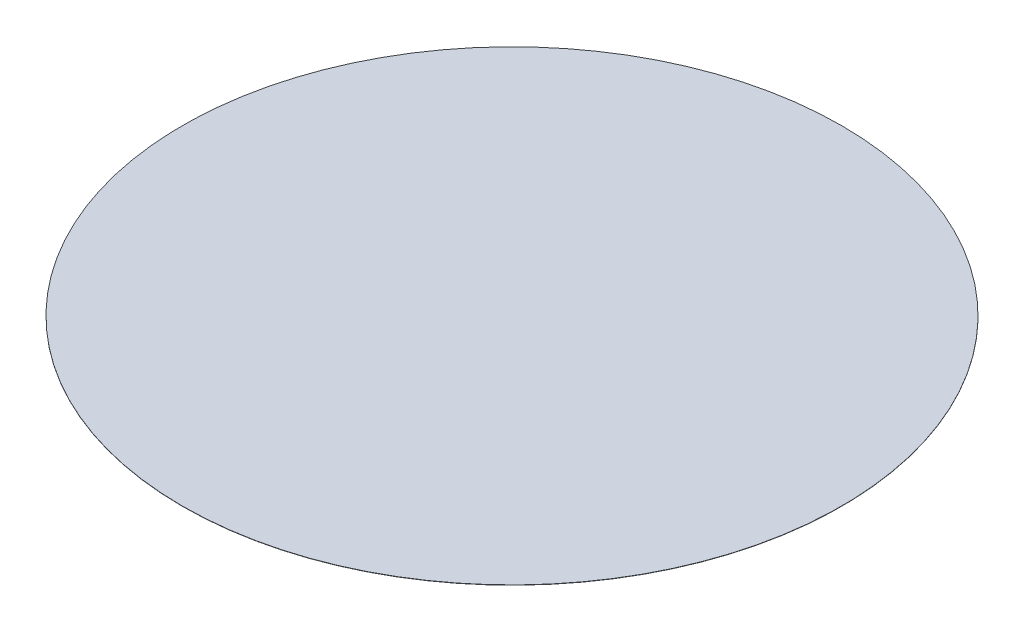
ISO-10303-21;
HEADER;
FILE_DESCRIPTION(('STEP AP214'),'2;1');
FILE_NAME('part.step','',(''),(''),'','','');
FILE_SCHEMA(('AUTOMOTIVE_DESIGN { 1 0 10303 214 1 1 1 1 }'));
ENDSEC;
DATA;
#1=APPLICATION_CONTEXT('core data for automotive mechanical design processes');
#2=APPLICATION_PROTOCOL_DEFINITION('international standard','automotive_design',2000,#1);
#3=PRODUCT_CONTEXT('',#1,'mechanical');
#4=PRODUCT('Part','Part','',(#3));
#5=PRODUCT_RELATED_PRODUCT_CATEGORY('part','',(#4));
#6=PRODUCT_DEFINITION_FORMATION('','',#4);
#7=PRODUCT_DEFINITION_CONTEXT('part definition',#1,'design');
#8=PRODUCT_DEFINITION('design','',#6,#7);
#9=PRODUCT_DEFINITION_SHAPE('','',#8);
#10=(LENGTH_UNIT() NAMED_UNIT(*) SI_UNIT(.MILLI.,.METRE.));
#11=(NAMED_UNIT(*) PLANE_ANGLE_UNIT() SI_UNIT($,.RADIAN.));
#12=(NAMED_UNIT(*) SI_UNIT($,.STERADIAN.) SOLID_ANGLE_UNIT());
#13=UNCERTAINTY_MEASURE_WITH_UNIT(LENGTH_MEASURE(1.E-05),#10,'distance_accuracy_value','');
#14=(GEOMETRIC_REPRESENTATION_CONTEXT(3) GLOBAL_UNCERTAINTY_ASSIGNED_CONTEXT((#13)) GLOBAL_UNIT_ASSIGNED_CONTEXT((#10,
#11,#12)) REPRESENTATION_CONTEXT('',''));
#15=CARTESIAN_POINT('',(0.,0.,0.));
#16=DIRECTION('',(0.,0.,1.));
#17=DIRECTION('',(1.,0.,0.));
#18=AXIS2_PLACEMENT_3D('',#15,#16,#17);
#19=CARTESIAN_POINT('',(0.,1.,0.));
#20=DIRECTION('',(0.,-1.,0.));
#21=DIRECTION('',(0.,0.,-1.));
#22=AXIS2_PLACEMENT_3D('',#19,#20,#21);
#23=CYLINDRICAL_SURFACE('',#22,2500.);
#24=CARTESIAN_POINT('',(0.,1.,0.));
#25=DIRECTION('',(0.,1.,0.));
#26=DIRECTION('',(0.,0.,1.));
#27=AXIS2_PLACEMENT_3D('',#24,#25,#26);
#28=CIRCLE('',#27,2500.);
#29=CARTESIAN_POINT('',(0.,1.,2500.));
#30=VERTEX_POINT('',#29);
#31=EDGE_CURVE('E10',#30,#30,#28,.T.);
#32=ORIENTED_EDGE('',*,*,#31,.F.);
#33=EDGE_LOOP('',(#32));
#34=FACE_BOUND('',#33,.T.);
#35=CARTESIAN_POINT('',(0.,-1.,0.));
#36=DIRECTION('',(0.,1.,0.));
#37=DIRECTION('',(0.,0.,1.));
#38=AXIS2_PLACEMENT_3D('',#35,#36,#37);
#39=CIRCLE('',#38,2500.);
#40=CARTESIAN_POINT('',(0.,-1.,2500.));
#41=VERTEX_POINT('',#40);
#42=EDGE_CURVE('E37',#41,#41,#39,.T.);
#43=ORIENTED_EDGE('',*,*,#42,.T.);
#44=EDGE_LOOP('',(#43));
#45=FACE_BOUND('',#44,.T.);
#46=ADVANCED_FACE('F34',(#34,#45),#23,.T.);
#47=CARTESIAN_POINT('',(0.,1.,0.));
#48=DIRECTION('',(0.,1.,0.));
#49=DIRECTION('',(0.,0.,1.));
#50=AXIS2_PLACEMENT_3D('',#47,#48,#49);
#51=PLANE('',#50);
#52=ORIENTED_EDGE('',*,*,#31,.T.);
#53=EDGE_LOOP('',(#52));
#54=FACE_BOUND('',#53,.T.);
#55=ADVANCED_FACE('F49',(#54),#51,.T.);
#56=CARTESIAN_POINT('',(0.,-1.,0.));
#57=DIRECTION('',(0.,1.,0.));
#58=DIRECTION('',(0.,0.,1.));
#59=AXIS2_PLACEMENT_3D('',#56,#57,#58);
#60=PLANE('',#59);
#61=ORIENTED_EDGE('',*,*,#42,.F.);
#62=EDGE_LOOP('',(#61));
#63=FACE_BOUND('',#62,.T.);
#64=ADVANCED_FACE('F47',(#63),#60,.F.);
#65=CLOSED_SHELL('',(#46,#55,#64));
#66=MANIFOLD_SOLID_BREP('B2',#65);
#67=ADVANCED_BREP_SHAPE_REPRESENTATION('',(#18,#66),#14);
#68=SHAPE_DEFINITION_REPRESENTATION(#9,#67);
ENDSEC;
END-ISO-10303-21;
